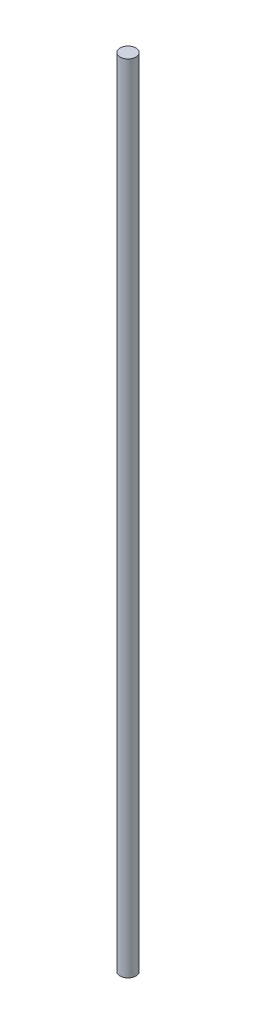
ISO-10303-21;
HEADER;
FILE_DESCRIPTION(('STEP AP214'),'2;1');
FILE_NAME('part.step','',(''),(''),'','','');
FILE_SCHEMA(('AUTOMOTIVE_DESIGN { 1 0 10303 214 1 1 1 1 }'));
ENDSEC;
DATA;
#1=APPLICATION_CONTEXT('core data for automotive mechanical design processes');
#2=APPLICATION_PROTOCOL_DEFINITION('international standard','automotive_design',2000,#1);
#3=PRODUCT_CONTEXT('',#1,'mechanical');
#4=PRODUCT('Part','Part','',(#3));
#5=PRODUCT_RELATED_PRODUCT_CATEGORY('part','',(#4));
#6=PRODUCT_DEFINITION_FORMATION('','',#4);
#7=PRODUCT_DEFINITION_CONTEXT('part definition',#1,'design');
#8=PRODUCT_DEFINITION('design','',#6,#7);
#9=PRODUCT_DEFINITION_SHAPE('','',#8);
#10=(LENGTH_UNIT() NAMED_UNIT(*) SI_UNIT(.MILLI.,.METRE.));
#11=(NAMED_UNIT(*) PLANE_ANGLE_UNIT() SI_UNIT($,.RADIAN.));
#12=(NAMED_UNIT(*) SI_UNIT($,.STERADIAN.) SOLID_ANGLE_UNIT());
#13=UNCERTAINTY_MEASURE_WITH_UNIT(LENGTH_MEASURE(1.E-05),#10,'distance_accuracy_value','');
#14=(GEOMETRIC_REPRESENTATION_CONTEXT(3) GLOBAL_UNCERTAINTY_ASSIGNED_CONTEXT((#13)) GLOBAL_UNIT_ASSIGNED_CONTEXT((#10,
#11,#12)) REPRESENTATION_CONTEXT('',''));
#15=CARTESIAN_POINT('',(0.,0.,0.));
#16=DIRECTION('',(0.,0.,1.));
#17=DIRECTION('',(1.,0.,0.));
#18=AXIS2_PLACEMENT_3D('',#15,#16,#17);
#19=CARTESIAN_POINT('',(0.,150.,0.));
#20=DIRECTION('',(0.,-1.,0.));
#21=DIRECTION('',(0.,0.,-1.));
#22=AXIS2_PLACEMENT_3D('',#19,#20,#21);
#23=CYLINDRICAL_SURFACE('',#22,1.5);
#24=CARTESIAN_POINT('',(0.,150.,0.));
#25=DIRECTION('',(0.,1.,0.));
#26=DIRECTION('',(0.,0.,1.));
#27=AXIS2_PLACEMENT_3D('',#24,#25,#26);
#28=CIRCLE('',#27,1.5);
#29=CARTESIAN_POINT('',(0.,150.,1.5));
#30=VERTEX_POINT('',#29);
#31=EDGE_CURVE('E10',#30,#30,#28,.T.);
#32=ORIENTED_EDGE('',*,*,#31,.F.);
#33=EDGE_LOOP('',(#32));
#34=FACE_BOUND('',#33,.T.);
#35=CARTESIAN_POINT('',(0.,0.,0.));
#36=DIRECTION('',(0.,1.,0.));
#37=DIRECTION('',(0.,0.,1.));
#38=AXIS2_PLACEMENT_3D('',#35,#36,#37);
#39=CIRCLE('',#38,1.5);
#40=CARTESIAN_POINT('',(0.,0.,1.5));
#41=VERTEX_POINT('',#40);
#42=EDGE_CURVE('E35',#41,#41,#39,.T.);
#43=ORIENTED_EDGE('',*,*,#42,.T.);
#44=EDGE_LOOP('',(#43));
#45=FACE_BOUND('',#44,.T.);
#46=ADVANCED_FACE('F32',(#34,#45),#23,.T.);
#47=CARTESIAN_POINT('',(0.,150.,0.));
#48=DIRECTION('',(0.,1.,0.));
#49=DIRECTION('',(0.,0.,1.));
#50=AXIS2_PLACEMENT_3D('',#47,#48,#49);
#51=PLANE('',#50);
#52=ORIENTED_EDGE('',*,*,#31,.T.);
#53=EDGE_LOOP('',(#52));
#54=FACE_BOUND('',#53,.T.);
#55=ADVANCED_FACE('F47',(#54),#51,.T.);
#56=CARTESIAN_POINT('',(0.,0.,0.));
#57=DIRECTION('',(0.,1.,0.));
#58=DIRECTION('',(0.,0.,1.));
#59=AXIS2_PLACEMENT_3D('',#56,#57,#58);
#60=PLANE('',#59);
#61=ORIENTED_EDGE('',*,*,#42,.F.);
#62=EDGE_LOOP('',(#61));
#63=FACE_BOUND('',#62,.T.);
#64=ADVANCED_FACE('F45',(#63),#60,.F.);
#65=CLOSED_SHELL('',(#46,#55,#64));
#66=MANIFOLD_SOLID_BREP('B2',#65);
#67=ADVANCED_BREP_SHAPE_REPRESENTATION('',(#18,#66),#14);
#68=SHAPE_DEFINITION_REPRESENTATION(#9,#67);
ENDSEC;
END-ISO-10303-21;
